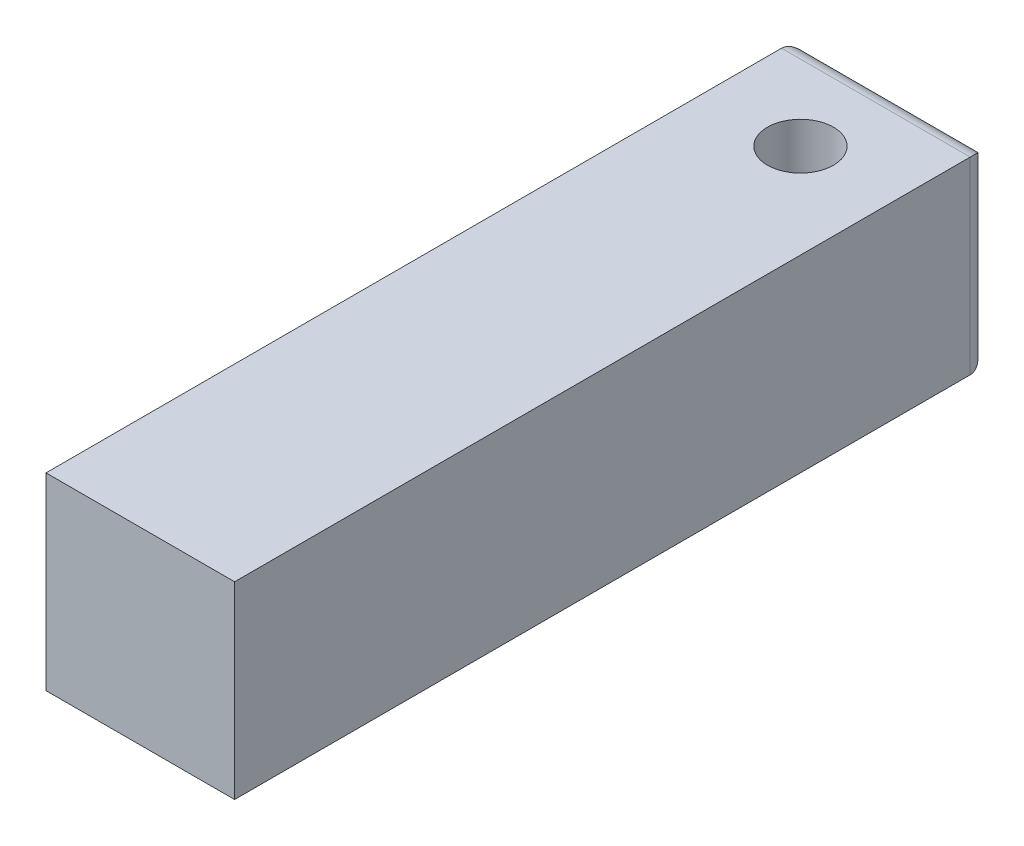
ISO-10303-21;
HEADER;
FILE_DESCRIPTION(('STEP AP214'),'2;1');
FILE_NAME('part.step','',(''),(''),'','','');
FILE_SCHEMA(('AUTOMOTIVE_DESIGN { 1 0 10303 214 1 1 1 1 }'));
ENDSEC;
DATA;
#1=APPLICATION_CONTEXT('core data for automotive mechanical design processes');
#2=APPLICATION_PROTOCOL_DEFINITION('international standard','automotive_design',2000,#1);
#3=PRODUCT_CONTEXT('',#1,'mechanical');
#4=PRODUCT('Part','Part','',(#3));
#5=PRODUCT_RELATED_PRODUCT_CATEGORY('part','',(#4));
#6=PRODUCT_DEFINITION_FORMATION('','',#4);
#7=PRODUCT_DEFINITION_CONTEXT('part definition',#1,'design');
#8=PRODUCT_DEFINITION('design','',#6,#7);
#9=PRODUCT_DEFINITION_SHAPE('','',#8);
#10=(LENGTH_UNIT() NAMED_UNIT(*) SI_UNIT(.MILLI.,.METRE.));
#11=(NAMED_UNIT(*) PLANE_ANGLE_UNIT() SI_UNIT($,.RADIAN.));
#12=(NAMED_UNIT(*) SI_UNIT($,.STERADIAN.) SOLID_ANGLE_UNIT());
#13=UNCERTAINTY_MEASURE_WITH_UNIT(LENGTH_MEASURE(1.E-05),#10,'distance_accuracy_value','');
#14=(GEOMETRIC_REPRESENTATION_CONTEXT(3) GLOBAL_UNCERTAINTY_ASSIGNED_CONTEXT((#13)) GLOBAL_UNIT_ASSIGNED_CONTEXT((#10,
#11,#12)) REPRESENTATION_CONTEXT('',''));
#15=CARTESIAN_POINT('',(0.,0.,0.));
#16=DIRECTION('',(0.,0.,1.));
#17=DIRECTION('',(1.,0.,0.));
#18=AXIS2_PLACEMENT_3D('',#15,#16,#17);
#19=CARTESIAN_POINT('',(0.,-10.,0.));
#20=DIRECTION('',(1.,0.,0.));
#21=DIRECTION('',(0.,0.,-1.));
#22=AXIS2_PLACEMENT_3D('',#19,#20,#21);
#23=PLANE('',#22);
#24=DIRECTION('',(0.,0.,-1.));
#25=VECTOR('',#24,1.);
#26=CARTESIAN_POINT('',(0.,-10.,0.));
#27=LINE('',#26,#25);
#28=CARTESIAN_POINT('',(0.,-10.,0.));
#29=VERTEX_POINT('',#28);
#30=CARTESIAN_POINT('',(0.,-10.,-39.));
#31=VERTEX_POINT('',#30);
#32=EDGE_CURVE('E92',#29,#31,#27,.T.);
#33=ORIENTED_EDGE('',*,*,#32,.T.);
#34=DIRECTION('',(0.,1.,0.));
#35=VECTOR('',#34,1.);
#36=CARTESIAN_POINT('',(0.,-10.,-39.));
#37=LINE('',#36,#35);
#38=CARTESIAN_POINT('',(0.,0.,-39.));
#39=VERTEX_POINT('',#38);
#40=EDGE_CURVE('E11',#31,#39,#37,.T.);
#41=ORIENTED_EDGE('',*,*,#40,.T.);
#42=DIRECTION('',(0.,0.,-1.));
#43=VECTOR('',#42,1.);
#44=CARTESIAN_POINT('',(0.,0.,0.));
#45=LINE('',#44,#43);
#46=CARTESIAN_POINT('',(0.,0.,0.));
#47=VERTEX_POINT('',#46);
#48=EDGE_CURVE('E105',#47,#39,#45,.T.);
#49=ORIENTED_EDGE('',*,*,#48,.F.);
#50=DIRECTION('',(0.,1.,0.));
#51=VECTOR('',#50,1.);
#52=CARTESIAN_POINT('',(0.,-10.,0.));
#53=LINE('',#52,#51);
#54=EDGE_CURVE('E99',#29,#47,#53,.T.);
#55=ORIENTED_EDGE('',*,*,#54,.F.);
#56=EDGE_LOOP('',(#33,#41,#49,#55));
#57=FACE_BOUND('',#56,.T.);
#58=ADVANCED_FACE('F32',(#57),#23,.T.);
#59=CARTESIAN_POINT('',(0.,-10.,0.));
#60=DIRECTION('',(0.,0.,1.));
#61=DIRECTION('',(1.,0.,0.));
#62=AXIS2_PLACEMENT_3D('',#59,#60,#61);
#63=PLANE('',#62);
#64=DIRECTION('',(1.,0.,0.));
#65=VECTOR('',#64,1.);
#66=CARTESIAN_POINT('',(0.,0.,0.));
#67=LINE('',#66,#65);
#68=CARTESIAN_POINT('',(-10.,0.,0.));
#69=VERTEX_POINT('',#68);
#70=EDGE_CURVE('E98',#69,#47,#67,.T.);
#71=ORIENTED_EDGE('',*,*,#70,.F.);
#72=DIRECTION('',(0.,1.,0.));
#73=VECTOR('',#72,1.);
#74=CARTESIAN_POINT('',(-10.,-10.,0.));
#75=LINE('',#74,#73);
#76=CARTESIAN_POINT('',(-10.,-10.,0.));
#77=VERTEX_POINT('',#76);
#78=EDGE_CURVE('E88',#77,#69,#75,.T.);
#79=ORIENTED_EDGE('',*,*,#78,.F.);
#80=DIRECTION('',(1.,0.,0.));
#81=VECTOR('',#80,1.);
#82=CARTESIAN_POINT('',(0.,-10.,0.));
#83=LINE('',#82,#81);
#84=EDGE_CURVE('E91',#77,#29,#83,.T.);
#85=ORIENTED_EDGE('',*,*,#84,.T.);
#86=ORIENTED_EDGE('',*,*,#54,.T.);
#87=EDGE_LOOP('',(#71,#79,#85,#86));
#88=FACE_BOUND('',#87,.T.);
#89=ADVANCED_FACE('F96',(#88),#63,.T.);
#90=CARTESIAN_POINT('',(-10.,-10.,0.));
#91=DIRECTION('',(-1.,0.,0.));
#92=DIRECTION('',(0.,0.,1.));
#93=AXIS2_PLACEMENT_3D('',#90,#91,#92);
#94=PLANE('',#93);
#95=DIRECTION('',(0.,0.,1.));
#96=VECTOR('',#95,1.);
#97=CARTESIAN_POINT('',(-10.,0.,0.));
#98=LINE('',#97,#96);
#99=CARTESIAN_POINT('',(-10.,0.,-39.));
#100=VERTEX_POINT('',#99);
#101=EDGE_CURVE('E108',#100,#69,#98,.T.);
#102=ORIENTED_EDGE('',*,*,#101,.F.);
#103=DIRECTION('',(0.,1.,0.));
#104=VECTOR('',#103,1.);
#105=CARTESIAN_POINT('',(-10.,-10.,-39.));
#106=LINE('',#105,#104);
#107=CARTESIAN_POINT('',(-10.,-10.,-39.));
#108=VERTEX_POINT('',#107);
#109=EDGE_CURVE('E41',#100,#108,#106,.F.);
#110=ORIENTED_EDGE('',*,*,#109,.T.);
#111=DIRECTION('',(0.,0.,1.));
#112=VECTOR('',#111,1.);
#113=CARTESIAN_POINT('',(-10.,-10.,0.));
#114=LINE('',#113,#112);
#115=EDGE_CURVE('E85',#108,#77,#114,.T.);
#116=ORIENTED_EDGE('',*,*,#115,.T.);
#117=ORIENTED_EDGE('',*,*,#78,.T.);
#118=EDGE_LOOP('',(#102,#110,#116,#117));
#119=FACE_BOUND('',#118,.T.);
#120=ADVANCED_FACE('F87',(#119),#94,.T.);
#121=CARTESIAN_POINT('',(0.,-10.,-40.));
#122=DIRECTION('',(0.,0.,-1.));
#123=DIRECTION('',(-1.,0.,0.));
#124=AXIS2_PLACEMENT_3D('',#121,#122,#123);
#125=PLANE('',#124);
#126=DIRECTION('',(-1.,0.,0.));
#127=VECTOR('',#126,1.);
#128=CARTESIAN_POINT('',(-10.,-9.,-40.));
#129=LINE('',#128,#127);
#130=CARTESIAN_POINT('',(-1.,-9.,-40.));
#131=VERTEX_POINT('',#130);
#132=CARTESIAN_POINT('',(-9.,-9.,-40.));
#133=VERTEX_POINT('',#132);
#134=EDGE_CURVE('E118',#131,#133,#129,.T.);
#135=ORIENTED_EDGE('',*,*,#134,.T.);
#136=DIRECTION('',(0.,1.,0.));
#137=VECTOR('',#136,1.);
#138=CARTESIAN_POINT('',(-9.,-10.,-40.));
#139=LINE('',#138,#137);
#140=CARTESIAN_POINT('',(-9.,-1.,-40.));
#141=VERTEX_POINT('',#140);
#142=EDGE_CURVE('E123',#133,#141,#139,.T.);
#143=ORIENTED_EDGE('',*,*,#142,.T.);
#144=DIRECTION('',(-1.,0.,0.));
#145=VECTOR('',#144,1.);
#146=CARTESIAN_POINT('',(0.,-0.999999999999999,-40.));
#147=LINE('',#146,#145);
#148=CARTESIAN_POINT('',(-1.,-1.,-40.));
#149=VERTEX_POINT('',#148);
#150=EDGE_CURVE('E120',#141,#149,#147,.F.);
#151=ORIENTED_EDGE('',*,*,#150,.T.);
#152=DIRECTION('',(0.,1.,0.));
#153=VECTOR('',#152,1.);
#154=CARTESIAN_POINT('',(-1.,-10.,-40.));
#155=LINE('',#154,#153);
#156=EDGE_CURVE('E116',#149,#131,#155,.F.);
#157=ORIENTED_EDGE('',*,*,#156,.T.);
#158=EDGE_LOOP('',(#135,#143,#151,#157));
#159=FACE_BOUND('',#158,.T.);
#160=ADVANCED_FACE('F170',(#159),#125,.T.);
#161=CARTESIAN_POINT('',(0.,-10.,0.));
#162=DIRECTION('',(0.,1.,0.));
#163=DIRECTION('',(0.,0.,1.));
#164=AXIS2_PLACEMENT_3D('',#161,#162,#163);
#165=PLANE('',#164);
#166=CARTESIAN_POINT('',(-5.,-10.,-35.));
#167=DIRECTION('',(0.,1.,0.));
#168=DIRECTION('',(0.,0.,1.));
#169=AXIS2_PLACEMENT_3D('',#166,#167,#168);
#170=CIRCLE('',#169,1.75);
#171=CARTESIAN_POINT('',(-5.,-10.,-33.25));
#172=VERTEX_POINT('',#171);
#173=EDGE_CURVE('E109',#172,#172,#170,.T.);
#174=ORIENTED_EDGE('',*,*,#173,.T.);
#175=EDGE_LOOP('',(#174));
#176=FACE_BOUND('',#175,.T.);
#177=ORIENTED_EDGE('',*,*,#115,.F.);
#178=DIRECTION('',(-1.,0.,0.));
#179=VECTOR('',#178,1.);
#180=CARTESIAN_POINT('',(0.,-10.,-39.));
#181=LINE('',#180,#179);
#182=EDGE_CURVE('E55',#108,#31,#181,.F.);
#183=ORIENTED_EDGE('',*,*,#182,.T.);
#184=ORIENTED_EDGE('',*,*,#32,.F.);
#185=ORIENTED_EDGE('',*,*,#84,.F.);
#186=EDGE_LOOP('',(#177,#183,#184,#185));
#187=FACE_BOUND('',#186,.T.);
#188=ADVANCED_FACE('F101',(#176,#187),#165,.F.);
#189=CARTESIAN_POINT('',(0.,0.,0.));
#190=DIRECTION('',(0.,1.,0.));
#191=DIRECTION('',(0.,0.,1.));
#192=AXIS2_PLACEMENT_3D('',#189,#190,#191);
#193=PLANE('',#192);
#194=CARTESIAN_POINT('',(-5.,0.,-35.));
#195=DIRECTION('',(0.,1.,0.));
#196=DIRECTION('',(0.,0.,1.));
#197=AXIS2_PLACEMENT_3D('',#194,#195,#196);
#198=CIRCLE('',#197,1.75);
#199=CARTESIAN_POINT('',(-5.,0.,-33.25));
#200=VERTEX_POINT('',#199);
#201=EDGE_CURVE('E136',#200,#200,#198,.T.);
#202=ORIENTED_EDGE('',*,*,#201,.F.);
#203=EDGE_LOOP('',(#202));
#204=FACE_BOUND('',#203,.T.);
#205=ORIENTED_EDGE('',*,*,#48,.T.);
#206=DIRECTION('',(-1.,0.,0.));
#207=VECTOR('',#206,1.);
#208=CARTESIAN_POINT('',(0.,0.,-39.));
#209=LINE('',#208,#207);
#210=EDGE_CURVE('E112',#39,#100,#209,.T.);
#211=ORIENTED_EDGE('',*,*,#210,.T.);
#212=ORIENTED_EDGE('',*,*,#101,.T.);
#213=ORIENTED_EDGE('',*,*,#70,.T.);
#214=EDGE_LOOP('',(#205,#211,#212,#213));
#215=FACE_BOUND('',#214,.T.);
#216=ADVANCED_FACE('F159',(#204,#215),#193,.T.);
#217=CARTESIAN_POINT('',(-5.,-10.,-35.));
#218=DIRECTION('',(0.,1.,0.));
#219=DIRECTION('',(0.,0.,1.));
#220=AXIS2_PLACEMENT_3D('',#217,#218,#219);
#221=CYLINDRICAL_SURFACE('',#220,1.75);
#222=ORIENTED_EDGE('',*,*,#173,.F.);
#223=EDGE_LOOP('',(#222));
#224=FACE_BOUND('',#223,.T.);
#225=ORIENTED_EDGE('',*,*,#201,.T.);
#226=EDGE_LOOP('',(#225));
#227=FACE_BOUND('',#226,.T.);
#228=ADVANCED_FACE('F161',(#224,#227),#221,.F.);
#229=CARTESIAN_POINT('',(0.,-9.,-39.));
#230=DIRECTION('',(1.,0.,0.));
#231=DIRECTION('',(0.,0.,-1.));
#232=AXIS2_PLACEMENT_3D('',#229,#230,#231);
#233=CYLINDRICAL_SURFACE('',#232,1.);
#234=CARTESIAN_POINT('',(-9.,-9.,-39.));
#235=DIRECTION('',(-0.707106781186547,0.707106781186547,0.));
#236=DIRECTION('',(0.707106781186547,0.707106781186547,0.));
#237=AXIS2_PLACEMENT_3D('',#234,#235,#236);
#238=ELLIPSE('',#237,1.41421356237309,1.);
#239=EDGE_CURVE('E130',#133,#108,#238,.T.);
#240=ORIENTED_EDGE('',*,*,#239,.F.);
#241=ORIENTED_EDGE('',*,*,#134,.F.);
#242=CARTESIAN_POINT('',(-1.,-9.,-39.));
#243=DIRECTION('',(0.707106781186547,0.707106781186547,0.));
#244=DIRECTION('',(-0.707106781186547,0.707106781186547,0.));
#245=AXIS2_PLACEMENT_3D('',#242,#243,#244);
#246=ELLIPSE('',#245,1.41421356237309,1.);
#247=EDGE_CURVE('E36',#31,#131,#246,.T.);
#248=ORIENTED_EDGE('',*,*,#247,.F.);
#249=ORIENTED_EDGE('',*,*,#182,.F.);
#250=EDGE_LOOP('',(#240,#241,#248,#249));
#251=FACE_BOUND('',#250,.T.);
#252=ADVANCED_FACE('F34',(#251),#233,.T.);
#253=CARTESIAN_POINT('',(-1.,-10.,-39.));
#254=DIRECTION('',(0.,1.,0.));
#255=DIRECTION('',(0.,0.,1.));
#256=AXIS2_PLACEMENT_3D('',#253,#254,#255);
#257=CYLINDRICAL_SURFACE('',#256,1.);
#258=ORIENTED_EDGE('',*,*,#247,.T.);
#259=ORIENTED_EDGE('',*,*,#156,.F.);
#260=CARTESIAN_POINT('',(-1.,-1.,-39.));
#261=DIRECTION('',(-0.707106781186547,0.707106781186547,0.));
#262=DIRECTION('',(0.707106781186547,0.707106781186547,0.));
#263=AXIS2_PLACEMENT_3D('',#260,#261,#262);
#264=ELLIPSE('',#263,1.41421356237309,1.);
#265=EDGE_CURVE('E129',#39,#149,#264,.T.);
#266=ORIENTED_EDGE('',*,*,#265,.F.);
#267=ORIENTED_EDGE('',*,*,#40,.F.);
#268=EDGE_LOOP('',(#258,#259,#266,#267));
#269=FACE_BOUND('',#268,.T.);
#270=ADVANCED_FACE('F152',(#269),#257,.T.);
#271=CARTESIAN_POINT('',(-9.,-10.,-39.));
#272=DIRECTION('',(0.,1.,0.));
#273=DIRECTION('',(0.,0.,1.));
#274=AXIS2_PLACEMENT_3D('',#271,#272,#273);
#275=CYLINDRICAL_SURFACE('',#274,1.);
#276=ORIENTED_EDGE('',*,*,#239,.T.);
#277=ORIENTED_EDGE('',*,*,#109,.F.);
#278=CARTESIAN_POINT('',(-9.,-1.,-39.));
#279=DIRECTION('',(0.707106781186547,0.707106781186547,0.));
#280=DIRECTION('',(-0.707106781186547,0.707106781186547,0.));
#281=AXIS2_PLACEMENT_3D('',#278,#279,#280);
#282=ELLIPSE('',#281,1.41421356237309,1.);
#283=EDGE_CURVE('E127',#141,#100,#282,.T.);
#284=ORIENTED_EDGE('',*,*,#283,.F.);
#285=ORIENTED_EDGE('',*,*,#142,.F.);
#286=EDGE_LOOP('',(#276,#277,#284,#285));
#287=FACE_BOUND('',#286,.T.);
#288=ADVANCED_FACE('F184',(#287),#275,.T.);
#289=CARTESIAN_POINT('',(0.,-1.,-39.));
#290=DIRECTION('',(-1.,0.,0.));
#291=DIRECTION('',(0.,0.,1.));
#292=AXIS2_PLACEMENT_3D('',#289,#290,#291);
#293=CYLINDRICAL_SURFACE('',#292,1.);
#294=ORIENTED_EDGE('',*,*,#265,.T.);
#295=ORIENTED_EDGE('',*,*,#150,.F.);
#296=ORIENTED_EDGE('',*,*,#283,.T.);
#297=ORIENTED_EDGE('',*,*,#210,.F.);
#298=EDGE_LOOP('',(#294,#295,#296,#297));
#299=FACE_BOUND('',#298,.T.);
#300=ADVANCED_FACE('F156',(#299),#293,.T.);
#301=CLOSED_SHELL('',(#58,#89,#120,#160,#188,#216,#228,#252,#270,#288,#300));
#302=MANIFOLD_SOLID_BREP('B2',#301);
#303=ADVANCED_BREP_SHAPE_REPRESENTATION('',(#18,#302),#14);
#304=SHAPE_DEFINITION_REPRESENTATION(#9,#303);
ENDSEC;
END-ISO-10303-21;
